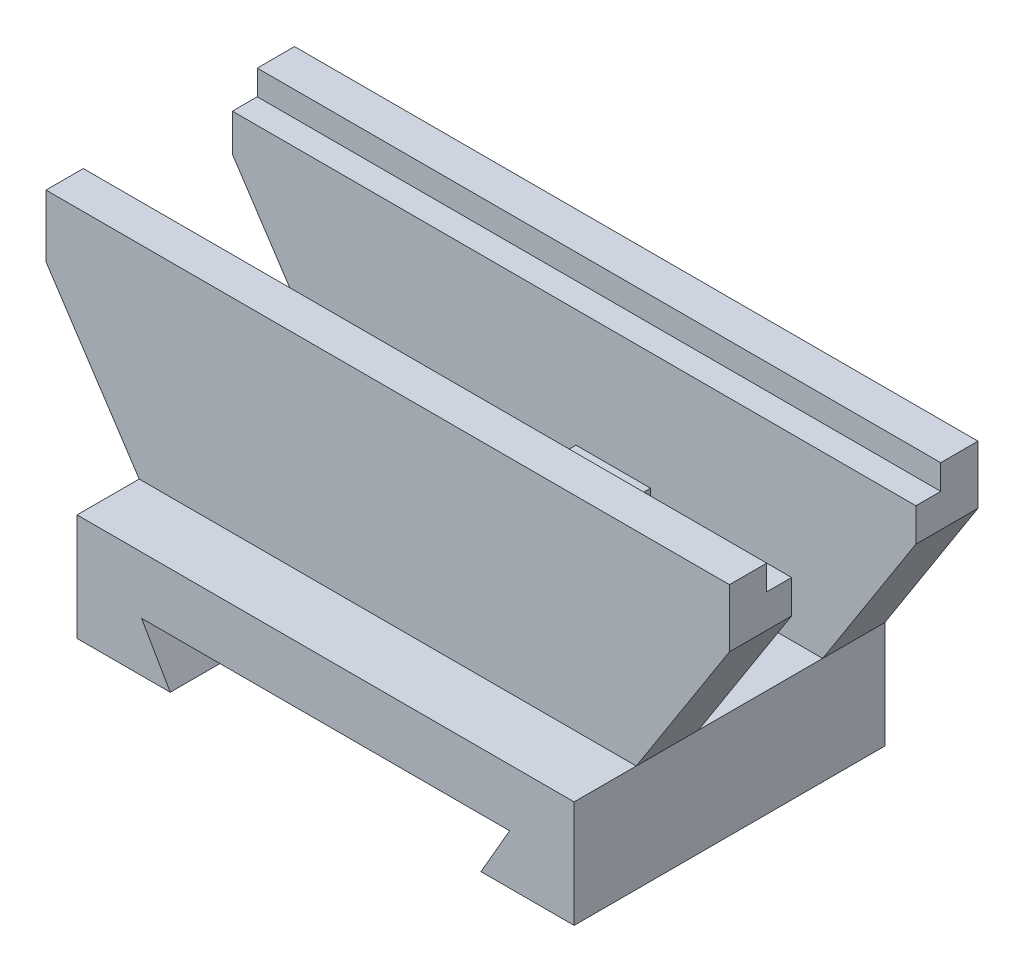
ISO-10303-21;
HEADER;
FILE_DESCRIPTION(('STEP AP214'),'2;1');
FILE_NAME('part.step','',(''),(''),'','','');
FILE_SCHEMA(('AUTOMOTIVE_DESIGN { 1 0 10303 214 1 1 1 1 }'));
ENDSEC;
DATA;
#1=APPLICATION_CONTEXT('core data for automotive mechanical design processes');
#2=APPLICATION_PROTOCOL_DEFINITION('international standard','automotive_design',2000,#1);
#3=PRODUCT_CONTEXT('',#1,'mechanical');
#4=PRODUCT('Part','Part','',(#3));
#5=PRODUCT_RELATED_PRODUCT_CATEGORY('part','',(#4));
#6=PRODUCT_DEFINITION_FORMATION('','',#4);
#7=PRODUCT_DEFINITION_CONTEXT('part definition',#1,'design');
#8=PRODUCT_DEFINITION('design','',#6,#7);
#9=PRODUCT_DEFINITION_SHAPE('','',#8);
#10=(LENGTH_UNIT() NAMED_UNIT(*) SI_UNIT(.MILLI.,.METRE.));
#11=(NAMED_UNIT(*) PLANE_ANGLE_UNIT() SI_UNIT($,.RADIAN.));
#12=(NAMED_UNIT(*) SI_UNIT($,.STERADIAN.) SOLID_ANGLE_UNIT());
#13=UNCERTAINTY_MEASURE_WITH_UNIT(LENGTH_MEASURE(1.E-05),#10,'distance_accuracy_value','');
#14=(GEOMETRIC_REPRESENTATION_CONTEXT(3) GLOBAL_UNCERTAINTY_ASSIGNED_CONTEXT((#13)) GLOBAL_UNIT_ASSIGNED_CONTEXT((#10,
#11,#12)) REPRESENTATION_CONTEXT('',''));
#15=CARTESIAN_POINT('',(0.,0.,0.));
#16=DIRECTION('',(0.,0.,1.));
#17=DIRECTION('',(1.,0.,0.));
#18=AXIS2_PLACEMENT_3D('',#15,#16,#17);
#19=CARTESIAN_POINT('',(0.,17.2208395061728,50.));
#20=DIRECTION('',(0.,1.,0.));
#21=DIRECTION('',(0.,0.,1.));
#22=AXIS2_PLACEMENT_3D('',#19,#20,#21);
#23=PLANE('',#22);
#24=DIRECTION('',(1.,0.,0.));
#25=VECTOR('',#24,1.);
#26=CARTESIAN_POINT('',(0.,17.2208395061728,30.));
#27=LINE('',#26,#25);
#28=CARTESIAN_POINT('',(0.,17.2208395061728,30.));
#29=VERTEX_POINT('',#28);
#30=CARTESIAN_POINT('',(80.,17.2208395061728,30.));
#31=VERTEX_POINT('',#30);
#32=EDGE_CURVE('E310',#29,#31,#27,.T.);
#33=ORIENTED_EDGE('',*,*,#32,.T.);
#34=DIRECTION('',(0.,0.,-1.));
#35=VECTOR('',#34,1.);
#36=CARTESIAN_POINT('',(80.,17.2208395061728,50.));
#37=LINE('',#36,#35);
#38=CARTESIAN_POINT('',(80.,17.2208395061728,10.));
#39=VERTEX_POINT('',#38);
#40=EDGE_CURVE('E423',#31,#39,#37,.T.);
#41=ORIENTED_EDGE('',*,*,#40,.T.);
#42=DIRECTION('',(1.,0.,0.));
#43=VECTOR('',#42,1.);
#44=CARTESIAN_POINT('',(0.,17.2208395061728,10.));
#45=LINE('',#44,#43);
#46=CARTESIAN_POINT('',(0.,17.2208395061728,10.));
#47=VERTEX_POINT('',#46);
#48=EDGE_CURVE('E328',#47,#39,#45,.T.);
#49=ORIENTED_EDGE('',*,*,#48,.F.);
#50=DIRECTION('',(0.,0.,-1.));
#51=VECTOR('',#50,1.);
#52=CARTESIAN_POINT('',(0.,17.2208395061728,50.));
#53=LINE('',#52,#51);
#54=EDGE_CURVE('E390',#29,#47,#53,.T.);
#55=ORIENTED_EDGE('',*,*,#54,.F.);
#56=EDGE_LOOP('',(#33,#41,#49,#55));
#57=FACE_BOUND('',#56,.T.);
#58=DIRECTION('',(0.,0.,-1.));
#59=VECTOR('',#58,1.);
#60=CARTESIAN_POINT('',(57.4198532251835,17.2208395061728,25.1261748422814));
#61=LINE('',#60,#59);
#62=CARTESIAN_POINT('',(57.4198532251835,17.2208395061728,25.1261748422814));
#63=VERTEX_POINT('',#62);
#64=CARTESIAN_POINT('',(57.4198532251835,17.2208395061728,15.1261748422814));
#65=VERTEX_POINT('',#64);
#66=EDGE_CURVE('E270',#63,#65,#61,.T.);
#67=ORIENTED_EDGE('',*,*,#66,.F.);
#68=DIRECTION('',(1.,0.,0.));
#69=VECTOR('',#68,1.);
#70=CARTESIAN_POINT('',(45.4198532251835,17.2208395061728,25.1261748422814));
#71=LINE('',#70,#69);
#72=CARTESIAN_POINT('',(45.4198532251835,17.2208395061728,25.1261748422814));
#73=VERTEX_POINT('',#72);
#74=EDGE_CURVE('E254',#73,#63,#71,.T.);
#75=ORIENTED_EDGE('',*,*,#74,.F.);
#76=DIRECTION('',(0.,0.,-1.));
#77=VECTOR('',#76,1.);
#78=CARTESIAN_POINT('',(45.4198532251835,17.2208395061728,25.1261748422814));
#79=LINE('',#78,#77);
#80=CARTESIAN_POINT('',(45.4198532251835,17.2208395061728,15.1261748422814));
#81=VERTEX_POINT('',#80);
#82=EDGE_CURVE('E259',#73,#81,#79,.T.);
#83=ORIENTED_EDGE('',*,*,#82,.T.);
#84=DIRECTION('',(1.,0.,0.));
#85=VECTOR('',#84,1.);
#86=CARTESIAN_POINT('',(45.4198532251835,17.2208395061728,15.1261748422814));
#87=LINE('',#86,#85);
#88=EDGE_CURVE('E273',#81,#65,#87,.T.);
#89=ORIENTED_EDGE('',*,*,#88,.T.);
#90=EDGE_LOOP('',(#67,#75,#83,#89));
#91=FACE_BOUND('',#90,.T.);
#92=ADVANCED_FACE('F32',(#57,#91),#23,.T.);
#93=CARTESIAN_POINT('',(80.,17.2208395061728,50.));
#94=VERTEX_POINT('',#93);
#95=CARTESIAN_POINT('',(80.,17.2208395061728,40.));
#96=VERTEX_POINT('',#95);
#97=EDGE_CURVE('E420',#94,#96,#37,.T.);
#98=ORIENTED_EDGE('',*,*,#97,.T.);
#99=DIRECTION('',(1.,0.,0.));
#100=VECTOR('',#99,1.);
#101=CARTESIAN_POINT('',(0.,17.2208395061728,40.));
#102=LINE('',#101,#100);
#103=CARTESIAN_POINT('',(0.,17.2208395061728,40.));
#104=VERTEX_POINT('',#103);
#105=EDGE_CURVE('E298',#104,#96,#102,.T.);
#106=ORIENTED_EDGE('',*,*,#105,.F.);
#107=CARTESIAN_POINT('',(0.,17.2208395061728,50.));
#108=VERTEX_POINT('',#107);
#109=EDGE_CURVE('E424',#108,#104,#53,.T.);
#110=ORIENTED_EDGE('',*,*,#109,.F.);
#111=DIRECTION('',(1.,0.,0.));
#112=VECTOR('',#111,1.);
#113=CARTESIAN_POINT('',(0.,17.2208395061728,50.));
#114=LINE('',#113,#112);
#115=EDGE_CURVE('E373',#108,#94,#114,.T.);
#116=ORIENTED_EDGE('',*,*,#115,.T.);
#117=EDGE_LOOP('',(#98,#106,#110,#116));
#118=FACE_BOUND('',#117,.T.);
#119=ADVANCED_FACE('F463',(#118),#23,.T.);
#120=CARTESIAN_POINT('',(0.,0.,50.));
#121=DIRECTION('',(-1.,0.,0.));
#122=DIRECTION('',(0.,0.,1.));
#123=AXIS2_PLACEMENT_3D('',#120,#121,#122);
#124=PLANE('',#123);
#125=DIRECTION('',(0.,1.,0.));
#126=VECTOR('',#125,1.);
#127=CARTESIAN_POINT('',(0.,0.,0.));
#128=LINE('',#127,#126);
#129=CARTESIAN_POINT('',(0.,0.,0.));
#130=VERTEX_POINT('',#129);
#131=CARTESIAN_POINT('',(0.,17.2208395061728,0.));
#132=VERTEX_POINT('',#131);
#133=EDGE_CURVE('E369',#130,#132,#128,.T.);
#134=ORIENTED_EDGE('',*,*,#133,.F.);
#135=DIRECTION('',(0.,0.,-1.));
#136=VECTOR('',#135,1.);
#137=CARTESIAN_POINT('',(0.,0.,50.));
#138=LINE('',#137,#136);
#139=CARTESIAN_POINT('',(0.,0.,50.));
#140=VERTEX_POINT('',#139);
#141=EDGE_CURVE('E40',#140,#130,#138,.T.);
#142=ORIENTED_EDGE('',*,*,#141,.F.);
#143=DIRECTION('',(0.,1.,0.));
#144=VECTOR('',#143,1.);
#145=CARTESIAN_POINT('',(0.,0.,50.));
#146=LINE('',#145,#144);
#147=EDGE_CURVE('E370',#140,#108,#146,.T.);
#148=ORIENTED_EDGE('',*,*,#147,.T.);
#149=ORIENTED_EDGE('',*,*,#109,.T.);
#150=DIRECTION('',(0.,0.,-1.));
#151=VECTOR('',#150,1.);
#152=CARTESIAN_POINT('',(0.,17.2208395061728,40.));
#153=LINE('',#152,#151);
#154=EDGE_CURVE('E317',#104,#29,#153,.T.);
#155=ORIENTED_EDGE('',*,*,#154,.T.);
#156=ORIENTED_EDGE('',*,*,#54,.T.);
#157=DIRECTION('',(0.,0.,-1.));
#158=VECTOR('',#157,1.);
#159=CARTESIAN_POINT('',(0.,17.2208395061728,10.));
#160=LINE('',#159,#158);
#161=EDGE_CURVE('E343',#47,#132,#160,.T.);
#162=ORIENTED_EDGE('',*,*,#161,.T.);
#163=EDGE_LOOP('',(#134,#142,#148,#149,#155,#156,#162));
#164=FACE_BOUND('',#163,.T.);
#165=ADVANCED_FACE('F34',(#164),#124,.T.);
#166=CARTESIAN_POINT('',(0.,0.,50.));
#167=DIRECTION('',(0.,1.,0.));
#168=DIRECTION('',(0.,0.,1.));
#169=AXIS2_PLACEMENT_3D('',#166,#167,#168);
#170=PLANE('',#169);
#171=DIRECTION('',(1.,0.,0.));
#172=VECTOR('',#171,1.);
#173=CARTESIAN_POINT('',(0.,0.,0.));
#174=LINE('',#173,#172);
#175=CARTESIAN_POINT('',(15.,0.,0.));
#176=VERTEX_POINT('',#175);
#177=EDGE_CURVE('E374',#130,#176,#174,.T.);
#178=ORIENTED_EDGE('',*,*,#177,.T.);
#179=DIRECTION('',(0.,0.,-1.));
#180=VECTOR('',#179,1.);
#181=CARTESIAN_POINT('',(15.,0.,50.));
#182=LINE('',#181,#180);
#183=CARTESIAN_POINT('',(15.,0.,50.));
#184=VERTEX_POINT('',#183);
#185=EDGE_CURVE('E407',#184,#176,#182,.T.);
#186=ORIENTED_EDGE('',*,*,#185,.F.);
#187=DIRECTION('',(1.,0.,0.));
#188=VECTOR('',#187,1.);
#189=CARTESIAN_POINT('',(0.,0.,50.));
#190=LINE('',#189,#188);
#191=EDGE_CURVE('E388',#140,#184,#190,.T.);
#192=ORIENTED_EDGE('',*,*,#191,.F.);
#193=ORIENTED_EDGE('',*,*,#141,.T.);
#194=EDGE_LOOP('',(#178,#186,#192,#193));
#195=FACE_BOUND('',#194,.T.);
#196=ADVANCED_FACE('F492',(#195),#170,.F.);
#197=CARTESIAN_POINT('',(10.381197846483,8.,50.));
#198=DIRECTION('',(0.86602540378444,0.499999999999998,0.));
#199=DIRECTION('',(-0.499999999999998,0.86602540378444,0.));
#200=AXIS2_PLACEMENT_3D('',#197,#198,#199);
#201=PLANE('',#200);
#202=DIRECTION('',(0.499999999999998,-0.86602540378444,0.));
#203=VECTOR('',#202,1.);
#204=CARTESIAN_POINT('',(10.381197846483,8.,0.));
#205=LINE('',#204,#203);
#206=CARTESIAN_POINT('',(10.381197846483,8.,0.));
#207=VERTEX_POINT('',#206);
#208=EDGE_CURVE('E401',#207,#176,#205,.T.);
#209=ORIENTED_EDGE('',*,*,#208,.F.);
#210=DIRECTION('',(0.,0.,-1.));
#211=VECTOR('',#210,1.);
#212=CARTESIAN_POINT('',(10.381197846483,8.,50.));
#213=LINE('',#212,#211);
#214=CARTESIAN_POINT('',(10.381197846483,8.,50.));
#215=VERTEX_POINT('',#214);
#216=EDGE_CURVE('E409',#215,#207,#213,.T.);
#217=ORIENTED_EDGE('',*,*,#216,.F.);
#218=DIRECTION('',(0.499999999999998,-0.86602540378444,0.));
#219=VECTOR('',#218,1.);
#220=CARTESIAN_POINT('',(10.381197846483,8.,50.));
#221=LINE('',#220,#219);
#222=EDGE_CURVE('E385',#215,#184,#221,.T.);
#223=ORIENTED_EDGE('',*,*,#222,.T.);
#224=ORIENTED_EDGE('',*,*,#185,.T.);
#225=EDGE_LOOP('',(#209,#217,#223,#224));
#226=FACE_BOUND('',#225,.T.);
#227=ADVANCED_FACE('F488',(#226),#201,.T.);
#228=CARTESIAN_POINT('',(10.381197846483,8.,50.));
#229=DIRECTION('',(0.,1.,0.));
#230=DIRECTION('',(0.,0.,1.));
#231=AXIS2_PLACEMENT_3D('',#228,#229,#230);
#232=PLANE('',#231);
#233=DIRECTION('',(1.,0.,0.));
#234=VECTOR('',#233,1.);
#235=CARTESIAN_POINT('',(10.381197846483,8.,0.));
#236=LINE('',#235,#234);
#237=CARTESIAN_POINT('',(69.6188021535171,8.,0.));
#238=VERTEX_POINT('',#237);
#239=EDGE_CURVE('E399',#207,#238,#236,.T.);
#240=ORIENTED_EDGE('',*,*,#239,.T.);
#241=DIRECTION('',(0.,0.,-1.));
#242=VECTOR('',#241,1.);
#243=CARTESIAN_POINT('',(69.6188021535171,8.,50.));
#244=LINE('',#243,#242);
#245=CARTESIAN_POINT('',(69.6188021535171,8.,50.));
#246=VERTEX_POINT('',#245);
#247=EDGE_CURVE('E411',#246,#238,#244,.T.);
#248=ORIENTED_EDGE('',*,*,#247,.F.);
#249=DIRECTION('',(1.,0.,0.));
#250=VECTOR('',#249,1.);
#251=CARTESIAN_POINT('',(10.381197846483,8.,50.));
#252=LINE('',#251,#250);
#253=EDGE_CURVE('E383',#215,#246,#252,.T.);
#254=ORIENTED_EDGE('',*,*,#253,.F.);
#255=ORIENTED_EDGE('',*,*,#216,.T.);
#256=EDGE_LOOP('',(#240,#248,#254,#255));
#257=FACE_BOUND('',#256,.T.);
#258=ADVANCED_FACE('F484',(#257),#232,.F.);
#259=CARTESIAN_POINT('',(69.6188021535171,8.,50.));
#260=DIRECTION('',(0.866025403784436,-0.500000000000005,0.));
#261=DIRECTION('',(0.500000000000005,0.866025403784436,0.));
#262=AXIS2_PLACEMENT_3D('',#259,#260,#261);
#263=PLANE('',#262);
#264=DIRECTION('',(-0.500000000000005,-0.866025403784436,0.));
#265=VECTOR('',#264,1.);
#266=CARTESIAN_POINT('',(69.6188021535171,8.,0.));
#267=LINE('',#266,#265);
#268=CARTESIAN_POINT('',(65.,0.,0.));
#269=VERTEX_POINT('',#268);
#270=EDGE_CURVE('E397',#238,#269,#267,.T.);
#271=ORIENTED_EDGE('',*,*,#270,.T.);
#272=DIRECTION('',(0.,0.,-1.));
#273=VECTOR('',#272,1.);
#274=CARTESIAN_POINT('',(65.,0.,50.));
#275=LINE('',#274,#273);
#276=CARTESIAN_POINT('',(65.,0.,50.));
#277=VERTEX_POINT('',#276);
#278=EDGE_CURVE('E414',#277,#269,#275,.T.);
#279=ORIENTED_EDGE('',*,*,#278,.F.);
#280=DIRECTION('',(-0.500000000000005,-0.866025403784436,0.));
#281=VECTOR('',#280,1.);
#282=CARTESIAN_POINT('',(69.6188021535171,8.,50.));
#283=LINE('',#282,#281);
#284=EDGE_CURVE('E381',#246,#277,#283,.T.);
#285=ORIENTED_EDGE('',*,*,#284,.F.);
#286=ORIENTED_EDGE('',*,*,#247,.T.);
#287=EDGE_LOOP('',(#271,#279,#285,#286));
#288=FACE_BOUND('',#287,.T.);
#289=ADVANCED_FACE('F480',(#288),#263,.F.);
#290=CARTESIAN_POINT('',(65.,0.,50.));
#291=DIRECTION('',(0.,1.,0.));
#292=DIRECTION('',(0.,0.,1.));
#293=AXIS2_PLACEMENT_3D('',#290,#291,#292);
#294=PLANE('',#293);
#295=DIRECTION('',(1.,0.,0.));
#296=VECTOR('',#295,1.);
#297=CARTESIAN_POINT('',(65.,0.,0.));
#298=LINE('',#297,#296);
#299=CARTESIAN_POINT('',(80.,0.,0.));
#300=VERTEX_POINT('',#299);
#301=EDGE_CURVE('E395',#269,#300,#298,.T.);
#302=ORIENTED_EDGE('',*,*,#301,.T.);
#303=DIRECTION('',(0.,0.,-1.));
#304=VECTOR('',#303,1.);
#305=CARTESIAN_POINT('',(80.,0.,50.));
#306=LINE('',#305,#304);
#307=CARTESIAN_POINT('',(80.,0.,50.));
#308=VERTEX_POINT('',#307);
#309=EDGE_CURVE('E417',#308,#300,#306,.T.);
#310=ORIENTED_EDGE('',*,*,#309,.F.);
#311=DIRECTION('',(1.,0.,0.));
#312=VECTOR('',#311,1.);
#313=CARTESIAN_POINT('',(65.,0.,50.));
#314=LINE('',#313,#312);
#315=EDGE_CURVE('E379',#277,#308,#314,.T.);
#316=ORIENTED_EDGE('',*,*,#315,.F.);
#317=ORIENTED_EDGE('',*,*,#278,.T.);
#318=EDGE_LOOP('',(#302,#310,#316,#317));
#319=FACE_BOUND('',#318,.T.);
#320=ADVANCED_FACE('F476',(#319),#294,.F.);
#321=CARTESIAN_POINT('',(80.,0.,50.));
#322=DIRECTION('',(-1.,0.,0.));
#323=DIRECTION('',(0.,0.,1.));
#324=AXIS2_PLACEMENT_3D('',#321,#322,#323);
#325=PLANE('',#324);
#326=DIRECTION('',(0.,1.,0.));
#327=VECTOR('',#326,1.);
#328=CARTESIAN_POINT('',(80.,0.,0.));
#329=LINE('',#328,#327);
#330=CARTESIAN_POINT('',(80.,17.2208395061728,0.));
#331=VERTEX_POINT('',#330);
#332=EDGE_CURVE('E393',#300,#331,#329,.T.);
#333=ORIENTED_EDGE('',*,*,#332,.T.);
#334=DIRECTION('',(0.,0.,-1.));
#335=VECTOR('',#334,1.);
#336=CARTESIAN_POINT('',(80.,17.2208395061728,10.));
#337=LINE('',#336,#335);
#338=EDGE_CURVE('E366',#39,#331,#337,.T.);
#339=ORIENTED_EDGE('',*,*,#338,.F.);
#340=ORIENTED_EDGE('',*,*,#40,.F.);
#341=DIRECTION('',(0.,0.,-1.));
#342=VECTOR('',#341,1.);
#343=CARTESIAN_POINT('',(80.,17.2208395061728,40.));
#344=LINE('',#343,#342);
#345=EDGE_CURVE('E314',#96,#31,#344,.T.);
#346=ORIENTED_EDGE('',*,*,#345,.F.);
#347=ORIENTED_EDGE('',*,*,#97,.F.);
#348=DIRECTION('',(0.,1.,0.));
#349=VECTOR('',#348,1.);
#350=CARTESIAN_POINT('',(80.,0.,50.));
#351=LINE('',#350,#349);
#352=EDGE_CURVE('E377',#308,#94,#351,.T.);
#353=ORIENTED_EDGE('',*,*,#352,.F.);
#354=ORIENTED_EDGE('',*,*,#309,.T.);
#355=EDGE_LOOP('',(#333,#339,#340,#346,#347,#353,#354));
#356=FACE_BOUND('',#355,.T.);
#357=ADVANCED_FACE('F472',(#356),#325,.F.);
#358=CARTESIAN_POINT('',(0.,0.,50.));
#359=DIRECTION('',(0.,0.,-1.));
#360=DIRECTION('',(-1.,0.,0.));
#361=AXIS2_PLACEMENT_3D('',#358,#359,#360);
#362=PLANE('',#361);
#363=ORIENTED_EDGE('',*,*,#147,.F.);
#364=ORIENTED_EDGE('',*,*,#191,.T.);
#365=ORIENTED_EDGE('',*,*,#222,.F.);
#366=ORIENTED_EDGE('',*,*,#253,.T.);
#367=ORIENTED_EDGE('',*,*,#284,.T.);
#368=ORIENTED_EDGE('',*,*,#315,.T.);
#369=ORIENTED_EDGE('',*,*,#352,.T.);
#370=ORIENTED_EDGE('',*,*,#115,.F.);
#371=EDGE_LOOP('',(#363,#364,#365,#366,#367,#368,#369,#370));
#372=FACE_BOUND('',#371,.T.);
#373=ADVANCED_FACE('F475',(#372),#362,.F.);
#374=CARTESIAN_POINT('',(0.,0.,0.));
#375=DIRECTION('',(0.,0.,-1.));
#376=DIRECTION('',(-1.,0.,0.));
#377=AXIS2_PLACEMENT_3D('',#374,#375,#376);
#378=PLANE('',#377);
#379=ORIENTED_EDGE('',*,*,#133,.T.);
#380=DIRECTION('',(-0.549982928491208,0.835175896663831,0.));
#381=VECTOR('',#380,1.);
#382=CARTESIAN_POINT('',(0.,17.2208395061728,0.));
#383=LINE('',#382,#381);
#384=CARTESIAN_POINT('',(-15.,39.9990709766024,0.));
#385=VERTEX_POINT('',#384);
#386=EDGE_CURVE('E332',#132,#385,#383,.T.);
#387=ORIENTED_EDGE('',*,*,#386,.T.);
#388=DIRECTION('',(0.,1.,0.));
#389=VECTOR('',#388,1.);
#390=CARTESIAN_POINT('',(-15.,39.9990709766024,0.));
#391=LINE('',#390,#389);
#392=CARTESIAN_POINT('',(-15.,50.,0.));
#393=VERTEX_POINT('',#392);
#394=EDGE_CURVE('E351',#385,#393,#391,.T.);
#395=ORIENTED_EDGE('',*,*,#394,.T.);
#396=DIRECTION('',(1.,0.,0.));
#397=VECTOR('',#396,1.);
#398=CARTESIAN_POINT('',(-15.,50.,0.));
#399=LINE('',#398,#397);
#400=CARTESIAN_POINT('',(95.,50.,0.));
#401=VERTEX_POINT('',#400);
#402=EDGE_CURVE('E348',#393,#401,#399,.T.);
#403=ORIENTED_EDGE('',*,*,#402,.T.);
#404=DIRECTION('',(0.,1.,0.));
#405=VECTOR('',#404,1.);
#406=CARTESIAN_POINT('',(95.,40.6394343854787,0.));
#407=LINE('',#406,#405);
#408=CARTESIAN_POINT('',(95.,40.6394343854787,0.));
#409=VERTEX_POINT('',#408);
#410=EDGE_CURVE('E345',#409,#401,#407,.T.);
#411=ORIENTED_EDGE('',*,*,#410,.F.);
#412=DIRECTION('',(0.539362300698022,0.842073814214489,0.));
#413=VECTOR('',#412,1.);
#414=CARTESIAN_POINT('',(80.,17.2208395061728,0.));
#415=LINE('',#414,#413);
#416=EDGE_CURVE('E327',#331,#409,#415,.T.);
#417=ORIENTED_EDGE('',*,*,#416,.F.);
#418=ORIENTED_EDGE('',*,*,#332,.F.);
#419=ORIENTED_EDGE('',*,*,#301,.F.);
#420=ORIENTED_EDGE('',*,*,#270,.F.);
#421=ORIENTED_EDGE('',*,*,#239,.F.);
#422=ORIENTED_EDGE('',*,*,#208,.T.);
#423=ORIENTED_EDGE('',*,*,#177,.F.);
#424=EDGE_LOOP('',(#379,#387,#395,#403,#411,#417,#418,#419,#420,#421,#422,#423));
#425=FACE_BOUND('',#424,.T.);
#426=ADVANCED_FACE('F497',(#425),#378,.T.);
#427=CARTESIAN_POINT('',(80.,17.2208395061728,10.));
#428=DIRECTION('',(-0.842073814214489,0.539362300698022,0.));
#429=DIRECTION('',(-0.539362300698022,-0.842073814214489,0.));
#430=AXIS2_PLACEMENT_3D('',#427,#428,#429);
#431=PLANE('',#430);
#432=ORIENTED_EDGE('',*,*,#416,.T.);
#433=DIRECTION('',(0.,0.,-1.));
#434=VECTOR('',#433,1.);
#435=CARTESIAN_POINT('',(95.,40.6394343854787,10.));
#436=LINE('',#435,#434);
#437=CARTESIAN_POINT('',(95.,40.6394343854787,10.));
#438=VERTEX_POINT('',#437);
#439=EDGE_CURVE('E363',#438,#409,#436,.T.);
#440=ORIENTED_EDGE('',*,*,#439,.F.);
#441=DIRECTION('',(0.539362300698022,0.842073814214489,0.));
#442=VECTOR('',#441,1.);
#443=CARTESIAN_POINT('',(80.,17.2208395061728,10.));
#444=LINE('',#443,#442);
#445=EDGE_CURVE('E331',#39,#438,#444,.T.);
#446=ORIENTED_EDGE('',*,*,#445,.F.);
#447=ORIENTED_EDGE('',*,*,#338,.T.);
#448=EDGE_LOOP('',(#432,#440,#446,#447));
#449=FACE_BOUND('',#448,.T.);
#450=ADVANCED_FACE('F500',(#449),#431,.F.);
#451=CARTESIAN_POINT('',(95.,40.6394343854787,10.));
#452=DIRECTION('',(-1.,0.,0.));
#453=DIRECTION('',(0.,0.,1.));
#454=AXIS2_PLACEMENT_3D('',#451,#452,#453);
#455=PLANE('',#454);
#456=DIRECTION('',(0.,0.,-1.));
#457=VECTOR('',#456,1.);
#458=CARTESIAN_POINT('',(95.,50.,10.));
#459=LINE('',#458,#457);
#460=CARTESIAN_POINT('',(95.,50.,6.));
#461=VERTEX_POINT('',#460);
#462=EDGE_CURVE('E361',#461,#401,#459,.T.);
#463=ORIENTED_EDGE('',*,*,#462,.F.);
#464=DIRECTION('',(0.,1.,0.));
#465=VECTOR('',#464,1.);
#466=CARTESIAN_POINT('',(95.,50.,6.));
#467=LINE('',#466,#465);
#468=CARTESIAN_POINT('',(95.,46.,6.));
#469=VERTEX_POINT('',#468);
#470=EDGE_CURVE('E233',#469,#461,#467,.T.);
#471=ORIENTED_EDGE('',*,*,#470,.F.);
#472=DIRECTION('',(0.,0.,-1.));
#473=VECTOR('',#472,1.);
#474=CARTESIAN_POINT('',(95.,46.,34.));
#475=LINE('',#474,#473);
#476=CARTESIAN_POINT('',(95.,46.,10.));
#477=VERTEX_POINT('',#476);
#478=EDGE_CURVE('E226',#477,#469,#475,.T.);
#479=ORIENTED_EDGE('',*,*,#478,.F.);
#480=DIRECTION('',(0.,1.,0.));
#481=VECTOR('',#480,1.);
#482=CARTESIAN_POINT('',(95.,40.6394343854787,10.));
#483=LINE('',#482,#481);
#484=EDGE_CURVE('E334',#438,#477,#483,.T.);
#485=ORIENTED_EDGE('',*,*,#484,.F.);
#486=ORIENTED_EDGE('',*,*,#439,.T.);
#487=ORIENTED_EDGE('',*,*,#410,.T.);
#488=EDGE_LOOP('',(#463,#471,#479,#485,#486,#487));
#489=FACE_BOUND('',#488,.T.);
#490=ADVANCED_FACE('F507',(#489),#455,.F.);
#491=CARTESIAN_POINT('',(-15.,50.,10.));
#492=DIRECTION('',(0.,1.,0.));
#493=DIRECTION('',(0.,0.,1.));
#494=AXIS2_PLACEMENT_3D('',#491,#492,#493);
#495=PLANE('',#494);
#496=DIRECTION('',(1.,0.,0.));
#497=VECTOR('',#496,1.);
#498=CARTESIAN_POINT('',(-15.,50.,6.));
#499=LINE('',#498,#497);
#500=CARTESIAN_POINT('',(-15.,50.,6.));
#501=VERTEX_POINT('',#500);
#502=EDGE_CURVE('E244',#501,#461,#499,.T.);
#503=ORIENTED_EDGE('',*,*,#502,.T.);
#504=ORIENTED_EDGE('',*,*,#462,.T.);
#505=ORIENTED_EDGE('',*,*,#402,.F.);
#506=DIRECTION('',(0.,0.,-1.));
#507=VECTOR('',#506,1.);
#508=CARTESIAN_POINT('',(-15.,50.,10.));
#509=LINE('',#508,#507);
#510=EDGE_CURVE('E359',#501,#393,#509,.T.);
#511=ORIENTED_EDGE('',*,*,#510,.F.);
#512=EDGE_LOOP('',(#503,#504,#505,#511));
#513=FACE_BOUND('',#512,.T.);
#514=ADVANCED_FACE('F511',(#513),#495,.T.);
#515=CARTESIAN_POINT('',(-15.,39.9990709766024,10.));
#516=DIRECTION('',(-1.,0.,0.));
#517=DIRECTION('',(0.,0.,1.));
#518=AXIS2_PLACEMENT_3D('',#515,#516,#517);
#519=PLANE('',#518);
#520=DIRECTION('',(0.,1.,0.));
#521=VECTOR('',#520,1.);
#522=CARTESIAN_POINT('',(-15.,50.,6.));
#523=LINE('',#522,#521);
#524=CARTESIAN_POINT('',(-15.,46.,6.));
#525=VERTEX_POINT('',#524);
#526=EDGE_CURVE('E216',#525,#501,#523,.T.);
#527=ORIENTED_EDGE('',*,*,#526,.T.);
#528=ORIENTED_EDGE('',*,*,#510,.T.);
#529=ORIENTED_EDGE('',*,*,#394,.F.);
#530=DIRECTION('',(0.,0.,-1.));
#531=VECTOR('',#530,1.);
#532=CARTESIAN_POINT('',(-15.,39.9990709766024,10.));
#533=LINE('',#532,#531);
#534=CARTESIAN_POINT('',(-15.,39.9990709766024,10.));
#535=VERTEX_POINT('',#534);
#536=EDGE_CURVE('E357',#535,#385,#533,.T.);
#537=ORIENTED_EDGE('',*,*,#536,.F.);
#538=DIRECTION('',(0.,1.,0.));
#539=VECTOR('',#538,1.);
#540=CARTESIAN_POINT('',(-15.,39.9990709766024,10.));
#541=LINE('',#540,#539);
#542=CARTESIAN_POINT('',(-15.,46.,10.));
#543=VERTEX_POINT('',#542);
#544=EDGE_CURVE('E337',#535,#543,#541,.T.);
#545=ORIENTED_EDGE('',*,*,#544,.T.);
#546=DIRECTION('',(0.,0.,-1.));
#547=VECTOR('',#546,1.);
#548=CARTESIAN_POINT('',(-15.,46.,34.));
#549=LINE('',#548,#547);
#550=EDGE_CURVE('E47',#543,#525,#549,.T.);
#551=ORIENTED_EDGE('',*,*,#550,.T.);
#552=EDGE_LOOP('',(#527,#528,#529,#537,#545,#551));
#553=FACE_BOUND('',#552,.T.);
#554=ADVANCED_FACE('F515',(#553),#519,.T.);
#555=CARTESIAN_POINT('',(0.,17.2208395061728,10.));
#556=DIRECTION('',(-0.835175896663831,-0.549982928491208,0.));
#557=DIRECTION('',(0.549982928491208,-0.835175896663831,0.));
#558=AXIS2_PLACEMENT_3D('',#555,#556,#557);
#559=PLANE('',#558);
#560=ORIENTED_EDGE('',*,*,#386,.F.);
#561=ORIENTED_EDGE('',*,*,#161,.F.);
#562=DIRECTION('',(-0.549982928491208,0.835175896663831,0.));
#563=VECTOR('',#562,1.);
#564=CARTESIAN_POINT('',(0.,17.2208395061728,10.));
#565=LINE('',#564,#563);
#566=EDGE_CURVE('E340',#47,#535,#565,.T.);
#567=ORIENTED_EDGE('',*,*,#566,.T.);
#568=ORIENTED_EDGE('',*,*,#536,.T.);
#569=EDGE_LOOP('',(#560,#561,#567,#568));
#570=FACE_BOUND('',#569,.T.);
#571=ADVANCED_FACE('F519',(#570),#559,.T.);
#572=CARTESIAN_POINT('',(0.,0.,10.));
#573=DIRECTION('',(0.,0.,1.));
#574=DIRECTION('',(1.,0.,0.));
#575=AXIS2_PLACEMENT_3D('',#572,#573,#574);
#576=PLANE('',#575);
#577=DIRECTION('',(1.,0.,0.));
#578=VECTOR('',#577,1.);
#579=CARTESIAN_POINT('',(0.,46.,10.));
#580=LINE('',#579,#578);
#581=EDGE_CURVE('E252',#543,#477,#580,.T.);
#582=ORIENTED_EDGE('',*,*,#581,.F.);
#583=ORIENTED_EDGE('',*,*,#544,.F.);
#584=ORIENTED_EDGE('',*,*,#566,.F.);
#585=ORIENTED_EDGE('',*,*,#48,.T.);
#586=ORIENTED_EDGE('',*,*,#445,.T.);
#587=ORIENTED_EDGE('',*,*,#484,.T.);
#588=EDGE_LOOP('',(#582,#583,#584,#585,#586,#587));
#589=FACE_BOUND('',#588,.T.);
#590=ADVANCED_FACE('F523',(#589),#576,.T.);
#591=CARTESIAN_POINT('',(95.,40.6394343854787,40.));
#592=DIRECTION('',(-1.,0.,0.));
#593=DIRECTION('',(0.,0.,1.));
#594=AXIS2_PLACEMENT_3D('',#591,#592,#593);
#595=PLANE('',#594);
#596=CARTESIAN_POINT('',(95.,46.,34.));
#597=VERTEX_POINT('',#596);
#598=CARTESIAN_POINT('',(95.,46.,30.));
#599=VERTEX_POINT('',#598);
#600=EDGE_CURVE('E54',#597,#599,#475,.T.);
#601=ORIENTED_EDGE('',*,*,#600,.F.);
#602=DIRECTION('',(0.,-1.,0.));
#603=VECTOR('',#602,1.);
#604=CARTESIAN_POINT('',(95.,50.,34.));
#605=LINE('',#604,#603);
#606=CARTESIAN_POINT('',(95.,50.,34.));
#607=VERTEX_POINT('',#606);
#608=EDGE_CURVE('E219',#607,#597,#605,.T.);
#609=ORIENTED_EDGE('',*,*,#608,.F.);
#610=DIRECTION('',(0.,0.,-1.));
#611=VECTOR('',#610,1.);
#612=CARTESIAN_POINT('',(95.,50.,40.));
#613=LINE('',#612,#611);
#614=CARTESIAN_POINT('',(95.,50.,40.));
#615=VERTEX_POINT('',#614);
#616=EDGE_CURVE('E325',#615,#607,#613,.T.);
#617=ORIENTED_EDGE('',*,*,#616,.F.);
#618=DIRECTION('',(0.,1.,0.));
#619=VECTOR('',#618,1.);
#620=CARTESIAN_POINT('',(95.,40.6394343854787,40.));
#621=LINE('',#620,#619);
#622=CARTESIAN_POINT('',(95.,40.6394343854787,40.));
#623=VERTEX_POINT('',#622);
#624=EDGE_CURVE('E287',#623,#615,#621,.T.);
#625=ORIENTED_EDGE('',*,*,#624,.F.);
#626=DIRECTION('',(0.,0.,-1.));
#627=VECTOR('',#626,1.);
#628=CARTESIAN_POINT('',(95.,40.6394343854787,40.));
#629=LINE('',#628,#627);
#630=CARTESIAN_POINT('',(95.,40.6394343854787,30.));
#631=VERTEX_POINT('',#630);
#632=EDGE_CURVE('E303',#623,#631,#629,.T.);
#633=ORIENTED_EDGE('',*,*,#632,.T.);
#634=DIRECTION('',(0.,1.,0.));
#635=VECTOR('',#634,1.);
#636=CARTESIAN_POINT('',(95.,40.6394343854787,30.));
#637=LINE('',#636,#635);
#638=EDGE_CURVE('E232',#631,#599,#637,.T.);
#639=ORIENTED_EDGE('',*,*,#638,.T.);
#640=EDGE_LOOP('',(#601,#609,#617,#625,#633,#639));
#641=FACE_BOUND('',#640,.T.);
#642=ADVANCED_FACE('F229',(#641),#595,.F.);
#643=CARTESIAN_POINT('',(-15.,50.,40.));
#644=DIRECTION('',(0.,-1.,0.));
#645=DIRECTION('',(0.,0.,-1.));
#646=AXIS2_PLACEMENT_3D('',#643,#644,#645);
#647=PLANE('',#646);
#648=ORIENTED_EDGE('',*,*,#616,.T.);
#649=DIRECTION('',(1.,0.,0.));
#650=VECTOR('',#649,1.);
#651=CARTESIAN_POINT('',(-15.,50.,34.));
#652=LINE('',#651,#650);
#653=CARTESIAN_POINT('',(-15.,50.,34.));
#654=VERTEX_POINT('',#653);
#655=EDGE_CURVE('E222',#654,#607,#652,.T.);
#656=ORIENTED_EDGE('',*,*,#655,.F.);
#657=DIRECTION('',(0.,0.,-1.));
#658=VECTOR('',#657,1.);
#659=CARTESIAN_POINT('',(-15.,50.,40.));
#660=LINE('',#659,#658);
#661=CARTESIAN_POINT('',(-15.,50.,40.));
#662=VERTEX_POINT('',#661);
#663=EDGE_CURVE('E322',#662,#654,#660,.T.);
#664=ORIENTED_EDGE('',*,*,#663,.F.);
#665=DIRECTION('',(-1.,0.,0.));
#666=VECTOR('',#665,1.);
#667=CARTESIAN_POINT('',(-15.,50.,40.));
#668=LINE('',#667,#666);
#669=EDGE_CURVE('E290',#615,#662,#668,.T.);
#670=ORIENTED_EDGE('',*,*,#669,.F.);
#671=EDGE_LOOP('',(#648,#656,#664,#670));
#672=FACE_BOUND('',#671,.T.);
#673=ADVANCED_FACE('F530',(#672),#647,.F.);
#674=CARTESIAN_POINT('',(-15.,39.9990709766024,40.));
#675=DIRECTION('',(1.,0.,0.));
#676=DIRECTION('',(0.,0.,-1.));
#677=AXIS2_PLACEMENT_3D('',#674,#675,#676);
#678=PLANE('',#677);
#679=ORIENTED_EDGE('',*,*,#663,.T.);
#680=DIRECTION('',(0.,-1.,0.));
#681=VECTOR('',#680,1.);
#682=CARTESIAN_POINT('',(-15.,50.,34.));
#683=LINE('',#682,#681);
#684=CARTESIAN_POINT('',(-15.,46.,34.));
#685=VERTEX_POINT('',#684);
#686=EDGE_CURVE('E235',#654,#685,#683,.T.);
#687=ORIENTED_EDGE('',*,*,#686,.T.);
#688=CARTESIAN_POINT('',(-15.,46.,30.));
#689=VERTEX_POINT('',#688);
#690=EDGE_CURVE('E212',#685,#689,#549,.T.);
#691=ORIENTED_EDGE('',*,*,#690,.T.);
#692=DIRECTION('',(0.,-1.,0.));
#693=VECTOR('',#692,1.);
#694=CARTESIAN_POINT('',(-15.,39.9990709766024,30.));
#695=LINE('',#694,#693);
#696=CARTESIAN_POINT('',(-15.,39.9990709766024,30.));
#697=VERTEX_POINT('',#696);
#698=EDGE_CURVE('E305',#689,#697,#695,.T.);
#699=ORIENTED_EDGE('',*,*,#698,.T.);
#700=DIRECTION('',(0.,0.,-1.));
#701=VECTOR('',#700,1.);
#702=CARTESIAN_POINT('',(-15.,39.9990709766024,40.));
#703=LINE('',#702,#701);
#704=CARTESIAN_POINT('',(-15.,39.9990709766024,40.));
#705=VERTEX_POINT('',#704);
#706=EDGE_CURVE('E319',#705,#697,#703,.T.);
#707=ORIENTED_EDGE('',*,*,#706,.F.);
#708=DIRECTION('',(0.,-1.,0.));
#709=VECTOR('',#708,1.);
#710=CARTESIAN_POINT('',(-15.,39.9990709766024,40.));
#711=LINE('',#710,#709);
#712=EDGE_CURVE('E293',#662,#705,#711,.T.);
#713=ORIENTED_EDGE('',*,*,#712,.F.);
#714=EDGE_LOOP('',(#679,#687,#691,#699,#707,#713));
#715=FACE_BOUND('',#714,.T.);
#716=ADVANCED_FACE('F533',(#715),#678,.F.);
#717=CARTESIAN_POINT('',(0.,17.2208395061728,40.));
#718=DIRECTION('',(0.835175896663831,0.549982928491208,0.));
#719=DIRECTION('',(-0.549982928491208,0.835175896663831,0.));
#720=AXIS2_PLACEMENT_3D('',#717,#718,#719);
#721=PLANE('',#720);
#722=DIRECTION('',(0.549982928491208,-0.835175896663831,0.));
#723=VECTOR('',#722,1.);
#724=CARTESIAN_POINT('',(0.,17.2208395061728,30.));
#725=LINE('',#724,#723);
#726=EDGE_CURVE('E307',#697,#29,#725,.T.);
#727=ORIENTED_EDGE('',*,*,#726,.T.);
#728=ORIENTED_EDGE('',*,*,#154,.F.);
#729=DIRECTION('',(0.549982928491208,-0.835175896663831,0.));
#730=VECTOR('',#729,1.);
#731=CARTESIAN_POINT('',(0.,17.2208395061728,40.));
#732=LINE('',#731,#730);
#733=EDGE_CURVE('E295',#705,#104,#732,.T.);
#734=ORIENTED_EDGE('',*,*,#733,.F.);
#735=ORIENTED_EDGE('',*,*,#706,.T.);
#736=EDGE_LOOP('',(#727,#728,#734,#735));
#737=FACE_BOUND('',#736,.T.);
#738=ADVANCED_FACE('F537',(#737),#721,.F.);
#739=CARTESIAN_POINT('',(80.,17.2208395061728,40.));
#740=DIRECTION('',(-0.842073814214489,0.539362300698022,0.));
#741=DIRECTION('',(-0.539362300698022,-0.842073814214489,0.));
#742=AXIS2_PLACEMENT_3D('',#739,#740,#741);
#743=PLANE('',#742);
#744=DIRECTION('',(0.539362300698022,0.842073814214489,0.));
#745=VECTOR('',#744,1.);
#746=CARTESIAN_POINT('',(80.,17.2208395061728,30.));
#747=LINE('',#746,#745);
#748=EDGE_CURVE('E291',#31,#631,#747,.T.);
#749=ORIENTED_EDGE('',*,*,#748,.T.);
#750=ORIENTED_EDGE('',*,*,#632,.F.);
#751=DIRECTION('',(0.539362300698022,0.842073814214489,0.));
#752=VECTOR('',#751,1.);
#753=CARTESIAN_POINT('',(80.,17.2208395061728,40.));
#754=LINE('',#753,#752);
#755=EDGE_CURVE('E301',#96,#623,#754,.T.);
#756=ORIENTED_EDGE('',*,*,#755,.F.);
#757=ORIENTED_EDGE('',*,*,#345,.T.);
#758=EDGE_LOOP('',(#749,#750,#756,#757));
#759=FACE_BOUND('',#758,.T.);
#760=ADVANCED_FACE('F541',(#759),#743,.F.);
#761=CARTESIAN_POINT('',(0.,0.,40.));
#762=DIRECTION('',(0.,0.,-1.));
#763=DIRECTION('',(-1.,0.,0.));
#764=AXIS2_PLACEMENT_3D('',#761,#762,#763);
#765=PLANE('',#764);
#766=ORIENTED_EDGE('',*,*,#624,.T.);
#767=ORIENTED_EDGE('',*,*,#669,.T.);
#768=ORIENTED_EDGE('',*,*,#712,.T.);
#769=ORIENTED_EDGE('',*,*,#733,.T.);
#770=ORIENTED_EDGE('',*,*,#105,.T.);
#771=ORIENTED_EDGE('',*,*,#755,.T.);
#772=EDGE_LOOP('',(#766,#767,#768,#769,#770,#771));
#773=FACE_BOUND('',#772,.T.);
#774=ADVANCED_FACE('F545',(#773),#765,.F.);
#775=CARTESIAN_POINT('',(0.,0.,30.));
#776=DIRECTION('',(0.,0.,-1.));
#777=DIRECTION('',(-1.,0.,0.));
#778=AXIS2_PLACEMENT_3D('',#775,#776,#777);
#779=PLANE('',#778);
#780=DIRECTION('',(-1.,0.,0.));
#781=VECTOR('',#780,1.);
#782=CARTESIAN_POINT('',(0.,46.,30.));
#783=LINE('',#782,#781);
#784=EDGE_CURVE('E11',#599,#689,#783,.T.);
#785=ORIENTED_EDGE('',*,*,#784,.F.);
#786=ORIENTED_EDGE('',*,*,#638,.F.);
#787=ORIENTED_EDGE('',*,*,#748,.F.);
#788=ORIENTED_EDGE('',*,*,#32,.F.);
#789=ORIENTED_EDGE('',*,*,#726,.F.);
#790=ORIENTED_EDGE('',*,*,#698,.F.);
#791=EDGE_LOOP('',(#785,#786,#787,#788,#789,#790));
#792=FACE_BOUND('',#791,.T.);
#793=ADVANCED_FACE('F460',(#792),#779,.T.);
#794=CARTESIAN_POINT('',(45.4198532251835,32.2208395061728,25.1261748422814));
#795=DIRECTION('',(0.,0.,-1.));
#796=DIRECTION('',(-1.,0.,0.));
#797=AXIS2_PLACEMENT_3D('',#794,#795,#796);
#798=PLANE('',#797);
#799=ORIENTED_EDGE('',*,*,#74,.T.);
#800=DIRECTION('',(0.,-1.,0.));
#801=VECTOR('',#800,1.);
#802=CARTESIAN_POINT('',(57.4198532251835,32.2208395061728,25.1261748422814));
#803=LINE('',#802,#801);
#804=CARTESIAN_POINT('',(57.4198532251835,32.2208395061728,25.1261748422814));
#805=VERTEX_POINT('',#804);
#806=EDGE_CURVE('E284',#805,#63,#803,.T.);
#807=ORIENTED_EDGE('',*,*,#806,.F.);
#808=DIRECTION('',(1.,0.,0.));
#809=VECTOR('',#808,1.);
#810=CARTESIAN_POINT('',(45.4198532251835,32.2208395061728,25.1261748422814));
#811=LINE('',#810,#809);
#812=CARTESIAN_POINT('',(45.4198532251835,32.2208395061728,25.1261748422814));
#813=VERTEX_POINT('',#812);
#814=EDGE_CURVE('E255',#813,#805,#811,.T.);
#815=ORIENTED_EDGE('',*,*,#814,.F.);
#816=DIRECTION('',(0.,-1.,0.));
#817=VECTOR('',#816,1.);
#818=CARTESIAN_POINT('',(45.4198532251835,32.2208395061728,25.1261748422814));
#819=LINE('',#818,#817);
#820=EDGE_CURVE('E267',#813,#73,#819,.T.);
#821=ORIENTED_EDGE('',*,*,#820,.T.);
#822=EDGE_LOOP('',(#799,#807,#815,#821));
#823=FACE_BOUND('',#822,.T.);
#824=ADVANCED_FACE('F444',(#823),#798,.F.);
#825=CARTESIAN_POINT('',(57.4198532251835,32.2208395061728,25.1261748422814));
#826=DIRECTION('',(-1.,0.,0.));
#827=DIRECTION('',(0.,0.,1.));
#828=AXIS2_PLACEMENT_3D('',#825,#826,#827);
#829=PLANE('',#828);
#830=CARTESIAN_POINT('',(57.4198532251835,25.2208395061728,20.1261748422814));
#831=DIRECTION('',(-1.,0.,0.));
#832=DIRECTION('',(0.,0.,1.));
#833=AXIS2_PLACEMENT_3D('',#830,#831,#832);
#834=CIRCLE('',#833,3.);
#835=CARTESIAN_POINT('',(57.4198532251835,25.2208395061728,23.1261748422814));
#836=VERTEX_POINT('',#835);
#837=EDGE_CURVE('E249',#836,#836,#834,.T.);
#838=ORIENTED_EDGE('',*,*,#837,.T.);
#839=EDGE_LOOP('',(#838));
#840=FACE_BOUND('',#839,.T.);
#841=ORIENTED_EDGE('',*,*,#66,.T.);
#842=DIRECTION('',(0.,-1.,0.));
#843=VECTOR('',#842,1.);
#844=CARTESIAN_POINT('',(57.4198532251835,32.2208395061728,15.1261748422814));
#845=LINE('',#844,#843);
#846=CARTESIAN_POINT('',(57.4198532251835,32.2208395061728,15.1261748422814));
#847=VERTEX_POINT('',#846);
#848=EDGE_CURVE('E281',#847,#65,#845,.T.);
#849=ORIENTED_EDGE('',*,*,#848,.F.);
#850=DIRECTION('',(0.,0.,-1.));
#851=VECTOR('',#850,1.);
#852=CARTESIAN_POINT('',(57.4198532251835,32.2208395061728,25.1261748422814));
#853=LINE('',#852,#851);
#854=EDGE_CURVE('E258',#805,#847,#853,.T.);
#855=ORIENTED_EDGE('',*,*,#854,.F.);
#856=ORIENTED_EDGE('',*,*,#806,.T.);
#857=EDGE_LOOP('',(#841,#849,#855,#856));
#858=FACE_BOUND('',#857,.T.);
#859=ADVANCED_FACE('F451',(#840,#858),#829,.F.);
#860=CARTESIAN_POINT('',(45.4198532251835,32.2208395061728,15.1261748422814));
#861=DIRECTION('',(0.,0.,-1.));
#862=DIRECTION('',(-1.,0.,0.));
#863=AXIS2_PLACEMENT_3D('',#860,#861,#862);
#864=PLANE('',#863);
#865=ORIENTED_EDGE('',*,*,#88,.F.);
#866=DIRECTION('',(0.,-1.,0.));
#867=VECTOR('',#866,1.);
#868=CARTESIAN_POINT('',(45.4198532251835,32.2208395061728,15.1261748422814));
#869=LINE('',#868,#867);
#870=CARTESIAN_POINT('',(45.4198532251835,32.2208395061728,15.1261748422814));
#871=VERTEX_POINT('',#870);
#872=EDGE_CURVE('E278',#871,#81,#869,.T.);
#873=ORIENTED_EDGE('',*,*,#872,.F.);
#874=DIRECTION('',(1.,0.,0.));
#875=VECTOR('',#874,1.);
#876=CARTESIAN_POINT('',(45.4198532251835,32.2208395061728,15.1261748422814));
#877=LINE('',#876,#875);
#878=EDGE_CURVE('E261',#871,#847,#877,.T.);
#879=ORIENTED_EDGE('',*,*,#878,.T.);
#880=ORIENTED_EDGE('',*,*,#848,.T.);
#881=EDGE_LOOP('',(#865,#873,#879,#880));
#882=FACE_BOUND('',#881,.T.);
#883=ADVANCED_FACE('F436',(#882),#864,.T.);
#884=CARTESIAN_POINT('',(45.4198532251835,32.2208395061728,25.1261748422814));
#885=DIRECTION('',(-1.,0.,0.));
#886=DIRECTION('',(0.,0.,1.));
#887=AXIS2_PLACEMENT_3D('',#884,#885,#886);
#888=PLANE('',#887);
#889=CARTESIAN_POINT('',(45.4198532251835,25.2208395061728,20.1261748422814));
#890=DIRECTION('',(-1.,0.,0.));
#891=DIRECTION('',(0.,0.,1.));
#892=AXIS2_PLACEMENT_3D('',#889,#890,#891);
#893=CIRCLE('',#892,3.);
#894=CARTESIAN_POINT('',(45.4198532251835,25.2208395061728,23.1261748422814));
#895=VERTEX_POINT('',#894);
#896=EDGE_CURVE('E243',#895,#895,#893,.T.);
#897=ORIENTED_EDGE('',*,*,#896,.F.);
#898=EDGE_LOOP('',(#897));
#899=FACE_BOUND('',#898,.T.);
#900=ORIENTED_EDGE('',*,*,#82,.F.);
#901=ORIENTED_EDGE('',*,*,#820,.F.);
#902=DIRECTION('',(0.,0.,-1.));
#903=VECTOR('',#902,1.);
#904=CARTESIAN_POINT('',(45.4198532251835,32.2208395061728,25.1261748422814));
#905=LINE('',#904,#903);
#906=EDGE_CURVE('E264',#813,#871,#905,.T.);
#907=ORIENTED_EDGE('',*,*,#906,.T.);
#908=ORIENTED_EDGE('',*,*,#872,.T.);
#909=EDGE_LOOP('',(#900,#901,#907,#908));
#910=FACE_BOUND('',#909,.T.);
#911=ADVANCED_FACE('F432',(#899,#910),#888,.T.);
#912=CARTESIAN_POINT('',(0.,32.2208395061728,0.));
#913=DIRECTION('',(0.,1.,0.));
#914=DIRECTION('',(0.,0.,1.));
#915=AXIS2_PLACEMENT_3D('',#912,#913,#914);
#916=PLANE('',#915);
#917=ORIENTED_EDGE('',*,*,#814,.T.);
#918=ORIENTED_EDGE('',*,*,#854,.T.);
#919=ORIENTED_EDGE('',*,*,#878,.F.);
#920=ORIENTED_EDGE('',*,*,#906,.F.);
#921=EDGE_LOOP('',(#917,#918,#919,#920));
#922=FACE_BOUND('',#921,.T.);
#923=ADVANCED_FACE('F435',(#922),#916,.T.);
#924=CARTESIAN_POINT('',(-15.,25.2208395061728,20.1261748422814));
#925=DIRECTION('',(1.,0.,0.));
#926=DIRECTION('',(0.,0.,-1.));
#927=AXIS2_PLACEMENT_3D('',#924,#925,#926);
#928=CYLINDRICAL_SURFACE('',#927,3.);
#929=ORIENTED_EDGE('',*,*,#896,.T.);
#930=EDGE_LOOP('',(#929));
#931=FACE_BOUND('',#930,.T.);
#932=ORIENTED_EDGE('',*,*,#837,.F.);
#933=EDGE_LOOP('',(#932));
#934=FACE_BOUND('',#933,.T.);
#935=ADVANCED_FACE('F429',(#931,#934),#928,.F.);
#936=CARTESIAN_POINT('',(-15.,46.,34.));
#937=DIRECTION('',(0.,-1.,0.));
#938=DIRECTION('',(0.,0.,-1.));
#939=AXIS2_PLACEMENT_3D('',#936,#937,#938);
#940=PLANE('',#939);
#941=ORIENTED_EDGE('',*,*,#784,.T.);
#942=ORIENTED_EDGE('',*,*,#690,.F.);
#943=DIRECTION('',(1.,0.,0.));
#944=VECTOR('',#943,1.);
#945=CARTESIAN_POINT('',(-15.,46.,34.));
#946=LINE('',#945,#944);
#947=EDGE_CURVE('E208',#685,#597,#946,.T.);
#948=ORIENTED_EDGE('',*,*,#947,.T.);
#949=ORIENTED_EDGE('',*,*,#600,.T.);
#950=EDGE_LOOP('',(#941,#942,#948,#949));
#951=FACE_BOUND('',#950,.T.);
#952=ADVANCED_FACE('F210',(#951),#940,.F.);
#953=CARTESIAN_POINT('',(-15.,50.,34.));
#954=DIRECTION('',(0.,0.,1.));
#955=DIRECTION('',(1.,0.,0.));
#956=AXIS2_PLACEMENT_3D('',#953,#954,#955);
#957=PLANE('',#956);
#958=ORIENTED_EDGE('',*,*,#947,.F.);
#959=ORIENTED_EDGE('',*,*,#686,.F.);
#960=ORIENTED_EDGE('',*,*,#655,.T.);
#961=ORIENTED_EDGE('',*,*,#608,.T.);
#962=EDGE_LOOP('',(#958,#959,#960,#961));
#963=FACE_BOUND('',#962,.T.);
#964=ADVANCED_FACE('F220',(#963),#957,.F.);
#965=ORIENTED_EDGE('',*,*,#581,.T.);
#966=ORIENTED_EDGE('',*,*,#478,.T.);
#967=DIRECTION('',(1.,0.,0.));
#968=VECTOR('',#967,1.);
#969=CARTESIAN_POINT('',(-15.,46.,6.));
#970=LINE('',#969,#968);
#971=EDGE_CURVE('E215',#525,#469,#970,.T.);
#972=ORIENTED_EDGE('',*,*,#971,.F.);
#973=ORIENTED_EDGE('',*,*,#550,.F.);
#974=EDGE_LOOP('',(#965,#966,#972,#973));
#975=FACE_BOUND('',#974,.T.);
#976=ADVANCED_FACE('F595',(#975),#940,.F.);
#977=CARTESIAN_POINT('',(-15.,50.,6.));
#978=DIRECTION('',(0.,0.,-1.));
#979=DIRECTION('',(-1.,0.,0.));
#980=AXIS2_PLACEMENT_3D('',#977,#978,#979);
#981=PLANE('',#980);
#982=ORIENTED_EDGE('',*,*,#502,.F.);
#983=ORIENTED_EDGE('',*,*,#526,.F.);
#984=ORIENTED_EDGE('',*,*,#971,.T.);
#985=ORIENTED_EDGE('',*,*,#470,.T.);
#986=EDGE_LOOP('',(#982,#983,#984,#985));
#987=FACE_BOUND('',#986,.T.);
#988=ADVANCED_FACE('F598',(#987),#981,.F.);
#989=CLOSED_SHELL('',(#92,#119,#165,#196,#227,#258,#289,#320,#357,#373,#426,#450,#490,#514,#554,
#571,#590,#642,#673,#716,#738,#760,#774,#793,#824,#859,#883,#911,#923,#935,#952,#964,#976,#988));
#990=MANIFOLD_SOLID_BREP('B2',#989);
#991=ADVANCED_BREP_SHAPE_REPRESENTATION('',(#18,#990),#14);
#992=SHAPE_DEFINITION_REPRESENTATION(#9,#991);
ENDSEC;
END-ISO-10303-21;
